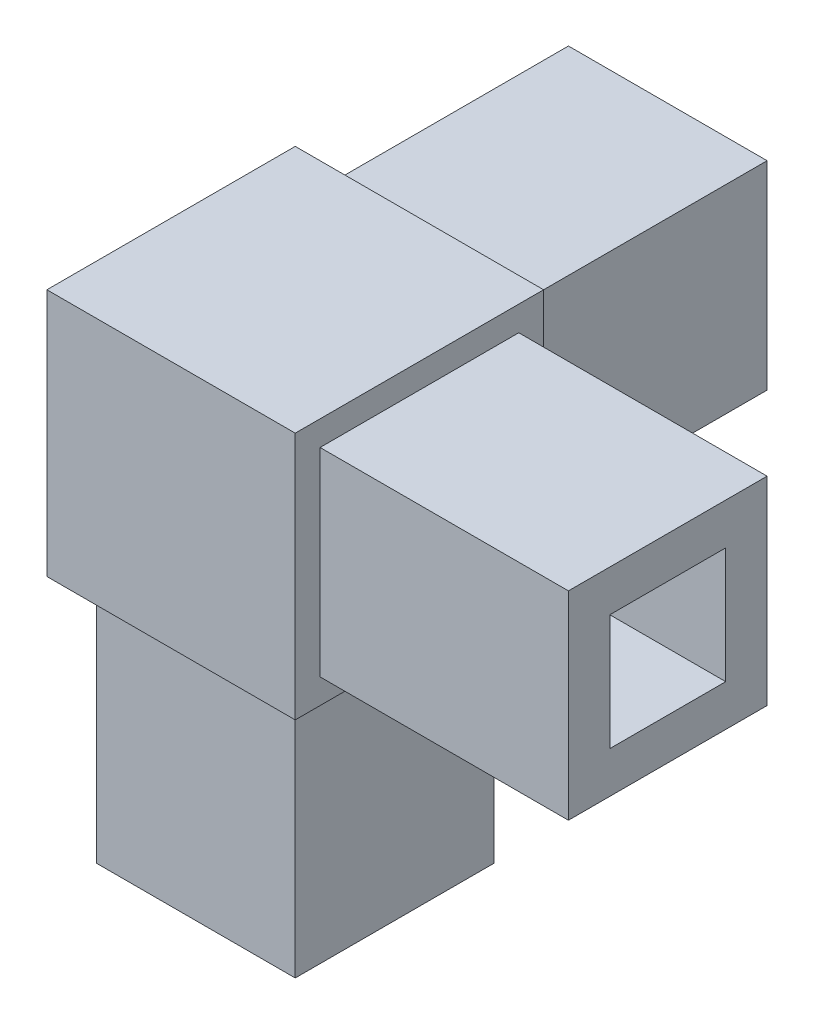
ISO-10303-21;
HEADER;
FILE_DESCRIPTION(('STEP AP214'),'2;1');
FILE_NAME('part.step','',(''),(''),'','','');
FILE_SCHEMA(('AUTOMOTIVE_DESIGN { 1 0 10303 214 1 1 1 1 }'));
ENDSEC;
DATA;
#1=APPLICATION_CONTEXT('core data for automotive mechanical design processes');
#2=APPLICATION_PROTOCOL_DEFINITION('international standard','automotive_design',2000,#1);
#3=PRODUCT_CONTEXT('',#1,'mechanical');
#4=PRODUCT('Part','Part','',(#3));
#5=PRODUCT_RELATED_PRODUCT_CATEGORY('part','',(#4));
#6=PRODUCT_DEFINITION_FORMATION('','',#4);
#7=PRODUCT_DEFINITION_CONTEXT('part definition',#1,'design');
#8=PRODUCT_DEFINITION('design','',#6,#7);
#9=PRODUCT_DEFINITION_SHAPE('','',#8);
#10=(LENGTH_UNIT() NAMED_UNIT(*) SI_UNIT(.MILLI.,.METRE.));
#11=(NAMED_UNIT(*) PLANE_ANGLE_UNIT() SI_UNIT($,.RADIAN.));
#12=(NAMED_UNIT(*) SI_UNIT($,.STERADIAN.) SOLID_ANGLE_UNIT());
#13=UNCERTAINTY_MEASURE_WITH_UNIT(LENGTH_MEASURE(1.E-05),#10,'distance_accuracy_value','');
#14=(GEOMETRIC_REPRESENTATION_CONTEXT(3) GLOBAL_UNCERTAINTY_ASSIGNED_CONTEXT((#13)) GLOBAL_UNIT_ASSIGNED_CONTEXT((#10,
#11,#12)) REPRESENTATION_CONTEXT('',''));
#15=CARTESIAN_POINT('',(0.,0.,0.));
#16=DIRECTION('',(0.,0.,1.));
#17=DIRECTION('',(1.,0.,0.));
#18=AXIS2_PLACEMENT_3D('',#15,#16,#17);
#19=CARTESIAN_POINT('',(45.,30.,-11.719834290647));
#20=DIRECTION('',(-1.,0.,0.));
#21=DIRECTION('',(0.,0.,1.));
#22=AXIS2_PLACEMENT_3D('',#19,#20,#21);
#23=PLANE('',#22);
#24=DIRECTION('',(0.,-1.,0.));
#25=VECTOR('',#24,1.);
#26=CARTESIAN_POINT('',(45.,27.,12.));
#27=LINE('',#26,#25);
#28=CARTESIAN_POINT('',(45.,27.,12.));
#29=VERTEX_POINT('',#28);
#30=CARTESIAN_POINT('',(45.,3.,12.));
#31=VERTEX_POINT('',#30);
#32=EDGE_CURVE('E460',#29,#31,#27,.T.);
#33=ORIENTED_EDGE('',*,*,#32,.T.);
#34=DIRECTION('',(0.,0.,-1.));
#35=VECTOR('',#34,1.);
#36=CARTESIAN_POINT('',(45.,3.,12.));
#37=LINE('',#36,#35);
#38=CARTESIAN_POINT('',(45.,3.,-12.));
#39=VERTEX_POINT('',#38);
#40=EDGE_CURVE('E477',#31,#39,#37,.T.);
#41=ORIENTED_EDGE('',*,*,#40,.T.);
#42=DIRECTION('',(0.,1.,0.));
#43=VECTOR('',#42,1.);
#44=CARTESIAN_POINT('',(45.,3.,-12.));
#45=LINE('',#44,#43);
#46=CARTESIAN_POINT('',(45.,27.,-12.));
#47=VERTEX_POINT('',#46);
#48=EDGE_CURVE('E480',#39,#47,#45,.T.);
#49=ORIENTED_EDGE('',*,*,#48,.T.);
#50=DIRECTION('',(0.,0.,1.));
#51=VECTOR('',#50,1.);
#52=CARTESIAN_POINT('',(45.,27.,-12.));
#53=LINE('',#52,#51);
#54=EDGE_CURVE('E465',#47,#29,#53,.T.);
#55=ORIENTED_EDGE('',*,*,#54,.T.);
#56=EDGE_LOOP('',(#33,#41,#49,#55));
#57=FACE_BOUND('',#56,.T.);
#58=DIRECTION('',(0.,-1.,0.));
#59=VECTOR('',#58,1.);
#60=CARTESIAN_POINT('',(45.,27.,7.));
#61=LINE('',#60,#59);
#62=CARTESIAN_POINT('',(45.,22.,7.));
#63=VERTEX_POINT('',#62);
#64=CARTESIAN_POINT('',(45.,8.,7.));
#65=VERTEX_POINT('',#64);
#66=EDGE_CURVE('E269',#63,#65,#61,.T.);
#67=ORIENTED_EDGE('',*,*,#66,.F.);
#68=DIRECTION('',(0.,0.,1.));
#69=VECTOR('',#68,1.);
#70=CARTESIAN_POINT('',(45.,22.,-12.));
#71=LINE('',#70,#69);
#72=CARTESIAN_POINT('',(45.,22.,-7.));
#73=VERTEX_POINT('',#72);
#74=EDGE_CURVE('E302',#73,#63,#71,.T.);
#75=ORIENTED_EDGE('',*,*,#74,.F.);
#76=DIRECTION('',(0.,1.,0.));
#77=VECTOR('',#76,1.);
#78=CARTESIAN_POINT('',(45.,3.,-7.));
#79=LINE('',#78,#77);
#80=CARTESIAN_POINT('',(45.,8.,-7.));
#81=VERTEX_POINT('',#80);
#82=EDGE_CURVE('E55',#81,#73,#79,.T.);
#83=ORIENTED_EDGE('',*,*,#82,.F.);
#84=DIRECTION('',(0.,0.,-1.));
#85=VECTOR('',#84,1.);
#86=CARTESIAN_POINT('',(45.,8.,12.));
#87=LINE('',#86,#85);
#88=EDGE_CURVE('E377',#65,#81,#87,.T.);
#89=ORIENTED_EDGE('',*,*,#88,.F.);
#90=EDGE_LOOP('',(#67,#75,#83,#89));
#91=FACE_BOUND('',#90,.T.);
#92=ADVANCED_FACE('F37',(#57,#91),#23,.F.);
#93=CARTESIAN_POINT('',(-15.,30.,-11.719834290647));
#94=DIRECTION('',(-1.,0.,0.));
#95=DIRECTION('',(0.,0.,1.));
#96=AXIS2_PLACEMENT_3D('',#93,#94,#95);
#97=PLANE('',#96);
#98=DIRECTION('',(0.,1.,0.));
#99=VECTOR('',#98,1.);
#100=CARTESIAN_POINT('',(-15.,-30.,-15.));
#101=LINE('',#100,#99);
#102=CARTESIAN_POINT('',(-15.,0.,-15.));
#103=VERTEX_POINT('',#102);
#104=CARTESIAN_POINT('',(-15.,30.,-15.));
#105=VERTEX_POINT('',#104);
#106=EDGE_CURVE('E495',#103,#105,#101,.T.);
#107=ORIENTED_EDGE('',*,*,#106,.F.);
#108=DIRECTION('',(0.,0.,-1.));
#109=VECTOR('',#108,1.);
#110=CARTESIAN_POINT('',(-15.,0.,15.));
#111=LINE('',#110,#109);
#112=CARTESIAN_POINT('',(-15.,0.,15.));
#113=VERTEX_POINT('',#112);
#114=EDGE_CURVE('E418',#113,#103,#111,.T.);
#115=ORIENTED_EDGE('',*,*,#114,.F.);
#116=DIRECTION('',(0.,-1.,0.));
#117=VECTOR('',#116,1.);
#118=CARTESIAN_POINT('',(-15.,30.,15.));
#119=LINE('',#118,#117);
#120=CARTESIAN_POINT('',(-15.,30.,15.));
#121=VERTEX_POINT('',#120);
#122=EDGE_CURVE('E11',#121,#113,#119,.T.);
#123=ORIENTED_EDGE('',*,*,#122,.F.);
#124=DIRECTION('',(0.,0.,-1.));
#125=VECTOR('',#124,1.);
#126=CARTESIAN_POINT('',(-15.,30.,-11.719834290647));
#127=LINE('',#126,#125);
#128=EDGE_CURVE('E496',#121,#105,#127,.T.);
#129=ORIENTED_EDGE('',*,*,#128,.T.);
#130=EDGE_LOOP('',(#107,#115,#123,#129));
#131=FACE_BOUND('',#130,.T.);
#132=ADVANCED_FACE('F39',(#131),#97,.T.);
#133=CARTESIAN_POINT('',(15.,30.,-11.719834290647));
#134=DIRECTION('',(-1.,0.,0.));
#135=DIRECTION('',(0.,0.,1.));
#136=AXIS2_PLACEMENT_3D('',#133,#134,#135);
#137=PLANE('',#136);
#138=DIRECTION('',(0.,0.,1.));
#139=VECTOR('',#138,1.);
#140=CARTESIAN_POINT('',(15.,27.,-12.));
#141=LINE('',#140,#139);
#142=CARTESIAN_POINT('',(15.,27.,-12.));
#143=VERTEX_POINT('',#142);
#144=CARTESIAN_POINT('',(15.,27.,12.));
#145=VERTEX_POINT('',#144);
#146=EDGE_CURVE('E471',#143,#145,#141,.T.);
#147=ORIENTED_EDGE('',*,*,#146,.F.);
#148=DIRECTION('',(0.,1.,0.));
#149=VECTOR('',#148,1.);
#150=CARTESIAN_POINT('',(15.,3.,-12.));
#151=LINE('',#150,#149);
#152=CARTESIAN_POINT('',(15.,3.,-12.));
#153=VERTEX_POINT('',#152);
#154=EDGE_CURVE('E468',#153,#143,#151,.T.);
#155=ORIENTED_EDGE('',*,*,#154,.F.);
#156=DIRECTION('',(0.,0.,-1.));
#157=VECTOR('',#156,1.);
#158=CARTESIAN_POINT('',(15.,3.,12.));
#159=LINE('',#158,#157);
#160=CARTESIAN_POINT('',(15.,3.,12.));
#161=VERTEX_POINT('',#160);
#162=EDGE_CURVE('E464',#161,#153,#159,.T.);
#163=ORIENTED_EDGE('',*,*,#162,.F.);
#164=DIRECTION('',(0.,-1.,0.));
#165=VECTOR('',#164,1.);
#166=CARTESIAN_POINT('',(15.,27.,12.));
#167=LINE('',#166,#165);
#168=EDGE_CURVE('E461',#145,#161,#167,.T.);
#169=ORIENTED_EDGE('',*,*,#168,.F.);
#170=EDGE_LOOP('',(#147,#155,#163,#169));
#171=FACE_BOUND('',#170,.T.);
#172=DIRECTION('',(0.,0.,1.));
#173=VECTOR('',#172,1.);
#174=CARTESIAN_POINT('',(15.,0.,-15.));
#175=LINE('',#174,#173);
#176=CARTESIAN_POINT('',(15.,0.,-15.));
#177=VERTEX_POINT('',#176);
#178=CARTESIAN_POINT('',(15.,0.,15.));
#179=VERTEX_POINT('',#178);
#180=EDGE_CURVE('E422',#177,#179,#175,.T.);
#181=ORIENTED_EDGE('',*,*,#180,.F.);
#182=DIRECTION('',(0.,1.,0.));
#183=VECTOR('',#182,1.);
#184=CARTESIAN_POINT('',(15.,-30.,-15.));
#185=LINE('',#184,#183);
#186=CARTESIAN_POINT('',(15.,30.,-15.));
#187=VERTEX_POINT('',#186);
#188=EDGE_CURVE('E493',#177,#187,#185,.T.);
#189=ORIENTED_EDGE('',*,*,#188,.T.);
#190=DIRECTION('',(0.,0.,-1.));
#191=VECTOR('',#190,1.);
#192=CARTESIAN_POINT('',(15.,30.,-11.719834290647));
#193=LINE('',#192,#191);
#194=CARTESIAN_POINT('',(15.,30.,15.));
#195=VERTEX_POINT('',#194);
#196=EDGE_CURVE('E47',#195,#187,#193,.T.);
#197=ORIENTED_EDGE('',*,*,#196,.F.);
#198=DIRECTION('',(0.,1.,0.));
#199=VECTOR('',#198,1.);
#200=CARTESIAN_POINT('',(15.,-30.,15.));
#201=LINE('',#200,#199);
#202=EDGE_CURVE('E41',#179,#195,#201,.T.);
#203=ORIENTED_EDGE('',*,*,#202,.F.);
#204=EDGE_LOOP('',(#181,#189,#197,#203));
#205=FACE_BOUND('',#204,.T.);
#206=ADVANCED_FACE('F525',(#171,#205),#137,.F.);
#207=CARTESIAN_POINT('',(-70.1056236686776,30.,15.));
#208=DIRECTION('',(0.,0.,1.));
#209=DIRECTION('',(1.,0.,0.));
#210=AXIS2_PLACEMENT_3D('',#207,#208,#209);
#211=PLANE('',#210);
#212=ORIENTED_EDGE('',*,*,#122,.T.);
#213=DIRECTION('',(-1.,0.,0.));
#214=VECTOR('',#213,1.);
#215=CARTESIAN_POINT('',(15.,0.,15.));
#216=LINE('',#215,#214);
#217=EDGE_CURVE('E410',#179,#113,#216,.T.);
#218=ORIENTED_EDGE('',*,*,#217,.F.);
#219=ORIENTED_EDGE('',*,*,#202,.T.);
#220=DIRECTION('',(-1.,0.,0.));
#221=VECTOR('',#220,1.);
#222=CARTESIAN_POINT('',(-70.1056236686776,30.,15.));
#223=LINE('',#222,#221);
#224=EDGE_CURVE('E499',#195,#121,#223,.T.);
#225=ORIENTED_EDGE('',*,*,#224,.T.);
#226=EDGE_LOOP('',(#212,#218,#219,#225));
#227=FACE_BOUND('',#226,.T.);
#228=ADVANCED_FACE('F521',(#227),#211,.T.);
#229=CARTESIAN_POINT('',(-15.,-30.,-15.));
#230=DIRECTION('',(0.,0.,1.));
#231=DIRECTION('',(1.,0.,0.));
#232=AXIS2_PLACEMENT_3D('',#229,#230,#231);
#233=PLANE('',#232);
#234=DIRECTION('',(1.,0.,0.));
#235=VECTOR('',#234,1.);
#236=CARTESIAN_POINT('',(-12.,27.,-15.));
#237=LINE('',#236,#235);
#238=CARTESIAN_POINT('',(-12.,27.,-15.));
#239=VERTEX_POINT('',#238);
#240=CARTESIAN_POINT('',(12.,27.,-15.));
#241=VERTEX_POINT('',#240);
#242=EDGE_CURVE('E435',#239,#241,#237,.T.);
#243=ORIENTED_EDGE('',*,*,#242,.F.);
#244=DIRECTION('',(0.,1.,0.));
#245=VECTOR('',#244,1.);
#246=CARTESIAN_POINT('',(-12.,3.,-15.));
#247=LINE('',#246,#245);
#248=CARTESIAN_POINT('',(-12.,3.,-15.));
#249=VERTEX_POINT('',#248);
#250=EDGE_CURVE('E432',#249,#239,#247,.T.);
#251=ORIENTED_EDGE('',*,*,#250,.F.);
#252=DIRECTION('',(-1.,0.,0.));
#253=VECTOR('',#252,1.);
#254=CARTESIAN_POINT('',(12.,3.,-15.));
#255=LINE('',#254,#253);
#256=CARTESIAN_POINT('',(12.,3.,-15.));
#257=VERTEX_POINT('',#256);
#258=EDGE_CURVE('E428',#257,#249,#255,.T.);
#259=ORIENTED_EDGE('',*,*,#258,.F.);
#260=DIRECTION('',(0.,-1.,0.));
#261=VECTOR('',#260,1.);
#262=CARTESIAN_POINT('',(12.,27.,-15.));
#263=LINE('',#262,#261);
#264=EDGE_CURVE('E425',#241,#257,#263,.T.);
#265=ORIENTED_EDGE('',*,*,#264,.F.);
#266=EDGE_LOOP('',(#243,#251,#259,#265));
#267=FACE_BOUND('',#266,.T.);
#268=DIRECTION('',(1.,0.,0.));
#269=VECTOR('',#268,1.);
#270=CARTESIAN_POINT('',(-15.,0.,-15.));
#271=LINE('',#270,#269);
#272=EDGE_CURVE('E420',#103,#177,#271,.T.);
#273=ORIENTED_EDGE('',*,*,#272,.F.);
#274=ORIENTED_EDGE('',*,*,#106,.T.);
#275=DIRECTION('',(1.,0.,0.));
#276=VECTOR('',#275,1.);
#277=CARTESIAN_POINT('',(-15.,30.,-15.));
#278=LINE('',#277,#276);
#279=EDGE_CURVE('E451',#105,#187,#278,.T.);
#280=ORIENTED_EDGE('',*,*,#279,.T.);
#281=ORIENTED_EDGE('',*,*,#188,.F.);
#282=EDGE_LOOP('',(#273,#274,#280,#281));
#283=FACE_BOUND('',#282,.T.);
#284=ADVANCED_FACE('F509',(#267,#283),#233,.F.);
#285=CARTESIAN_POINT('',(-70.1056236686776,30.,-11.719834290647));
#286=DIRECTION('',(0.,1.,0.));
#287=DIRECTION('',(0.,0.,1.));
#288=AXIS2_PLACEMENT_3D('',#285,#286,#287);
#289=PLANE('',#288);
#290=ORIENTED_EDGE('',*,*,#196,.T.);
#291=ORIENTED_EDGE('',*,*,#279,.F.);
#292=ORIENTED_EDGE('',*,*,#128,.F.);
#293=ORIENTED_EDGE('',*,*,#224,.F.);
#294=EDGE_LOOP('',(#290,#291,#292,#293));
#295=FACE_BOUND('',#294,.T.);
#296=ADVANCED_FACE('F515',(#295),#289,.T.);
#297=CARTESIAN_POINT('',(15.,27.,12.));
#298=DIRECTION('',(0.,0.,1.));
#299=DIRECTION('',(1.,0.,0.));
#300=AXIS2_PLACEMENT_3D('',#297,#298,#299);
#301=PLANE('',#300);
#302=ORIENTED_EDGE('',*,*,#32,.F.);
#303=DIRECTION('',(1.,0.,0.));
#304=VECTOR('',#303,1.);
#305=CARTESIAN_POINT('',(15.,27.,12.));
#306=LINE('',#305,#304);
#307=EDGE_CURVE('E485',#145,#29,#306,.T.);
#308=ORIENTED_EDGE('',*,*,#307,.F.);
#309=ORIENTED_EDGE('',*,*,#168,.T.);
#310=DIRECTION('',(1.,0.,0.));
#311=VECTOR('',#310,1.);
#312=CARTESIAN_POINT('',(15.,3.,12.));
#313=LINE('',#312,#311);
#314=EDGE_CURVE('E474',#161,#31,#313,.T.);
#315=ORIENTED_EDGE('',*,*,#314,.T.);
#316=EDGE_LOOP('',(#302,#308,#309,#315));
#317=FACE_BOUND('',#316,.T.);
#318=ADVANCED_FACE('F576',(#317),#301,.T.);
#319=CARTESIAN_POINT('',(15.,27.,-12.));
#320=DIRECTION('',(0.,1.,0.));
#321=DIRECTION('',(0.,0.,1.));
#322=AXIS2_PLACEMENT_3D('',#319,#320,#321);
#323=PLANE('',#322);
#324=ORIENTED_EDGE('',*,*,#54,.F.);
#325=DIRECTION('',(1.,0.,0.));
#326=VECTOR('',#325,1.);
#327=CARTESIAN_POINT('',(15.,27.,-12.));
#328=LINE('',#327,#326);
#329=EDGE_CURVE('E487',#143,#47,#328,.T.);
#330=ORIENTED_EDGE('',*,*,#329,.F.);
#331=ORIENTED_EDGE('',*,*,#146,.T.);
#332=ORIENTED_EDGE('',*,*,#307,.T.);
#333=EDGE_LOOP('',(#324,#330,#331,#332));
#334=FACE_BOUND('',#333,.T.);
#335=ADVANCED_FACE('F577',(#334),#323,.T.);
#336=CARTESIAN_POINT('',(15.,3.,-12.));
#337=DIRECTION('',(0.,0.,-1.));
#338=DIRECTION('',(-1.,0.,0.));
#339=AXIS2_PLACEMENT_3D('',#336,#337,#338);
#340=PLANE('',#339);
#341=ORIENTED_EDGE('',*,*,#48,.F.);
#342=DIRECTION('',(1.,0.,0.));
#343=VECTOR('',#342,1.);
#344=CARTESIAN_POINT('',(15.,3.,-12.));
#345=LINE('',#344,#343);
#346=EDGE_CURVE('E489',#153,#39,#345,.T.);
#347=ORIENTED_EDGE('',*,*,#346,.F.);
#348=ORIENTED_EDGE('',*,*,#154,.T.);
#349=ORIENTED_EDGE('',*,*,#329,.T.);
#350=EDGE_LOOP('',(#341,#347,#348,#349));
#351=FACE_BOUND('',#350,.T.);
#352=ADVANCED_FACE('F569',(#351),#340,.T.);
#353=CARTESIAN_POINT('',(15.,3.,12.));
#354=DIRECTION('',(0.,-1.,0.));
#355=DIRECTION('',(0.,0.,-1.));
#356=AXIS2_PLACEMENT_3D('',#353,#354,#355);
#357=PLANE('',#356);
#358=ORIENTED_EDGE('',*,*,#40,.F.);
#359=ORIENTED_EDGE('',*,*,#314,.F.);
#360=ORIENTED_EDGE('',*,*,#162,.T.);
#361=ORIENTED_EDGE('',*,*,#346,.T.);
#362=EDGE_LOOP('',(#358,#359,#360,#361));
#363=FACE_BOUND('',#362,.T.);
#364=ADVANCED_FACE('F573',(#363),#357,.T.);
#365=CARTESIAN_POINT('',(12.,27.,-15.));
#366=DIRECTION('',(1.,0.,0.));
#367=DIRECTION('',(0.,1.,0.));
#368=AXIS2_PLACEMENT_3D('',#365,#366,#367);
#369=PLANE('',#368);
#370=DIRECTION('',(0.,-1.,0.));
#371=VECTOR('',#370,1.);
#372=CARTESIAN_POINT('',(12.,27.,-45.));
#373=LINE('',#372,#371);
#374=CARTESIAN_POINT('',(12.,27.,-45.));
#375=VERTEX_POINT('',#374);
#376=CARTESIAN_POINT('',(12.,3.,-45.));
#377=VERTEX_POINT('',#376);
#378=EDGE_CURVE('E424',#375,#377,#373,.T.);
#379=ORIENTED_EDGE('',*,*,#378,.F.);
#380=DIRECTION('',(0.,0.,-1.));
#381=VECTOR('',#380,1.);
#382=CARTESIAN_POINT('',(12.,27.,-15.));
#383=LINE('',#382,#381);
#384=EDGE_CURVE('E449',#241,#375,#383,.T.);
#385=ORIENTED_EDGE('',*,*,#384,.F.);
#386=ORIENTED_EDGE('',*,*,#264,.T.);
#387=DIRECTION('',(0.,0.,-1.));
#388=VECTOR('',#387,1.);
#389=CARTESIAN_POINT('',(12.,3.,-15.));
#390=LINE('',#389,#388);
#391=EDGE_CURVE('E438',#257,#377,#390,.T.);
#392=ORIENTED_EDGE('',*,*,#391,.T.);
#393=EDGE_LOOP('',(#379,#385,#386,#392));
#394=FACE_BOUND('',#393,.T.);
#395=ADVANCED_FACE('F587',(#394),#369,.T.);
#396=CARTESIAN_POINT('',(-12.,27.,-15.));
#397=DIRECTION('',(0.,1.,0.));
#398=DIRECTION('',(-1.,0.,0.));
#399=AXIS2_PLACEMENT_3D('',#396,#397,#398);
#400=PLANE('',#399);
#401=DIRECTION('',(1.,0.,0.));
#402=VECTOR('',#401,1.);
#403=CARTESIAN_POINT('',(-12.,27.,-45.));
#404=LINE('',#403,#402);
#405=CARTESIAN_POINT('',(-12.,27.,-45.));
#406=VERTEX_POINT('',#405);
#407=EDGE_CURVE('E429',#406,#375,#404,.T.);
#408=ORIENTED_EDGE('',*,*,#407,.F.);
#409=DIRECTION('',(0.,0.,-1.));
#410=VECTOR('',#409,1.);
#411=CARTESIAN_POINT('',(-12.,27.,-15.));
#412=LINE('',#411,#410);
#413=EDGE_CURVE('E452',#239,#406,#412,.T.);
#414=ORIENTED_EDGE('',*,*,#413,.F.);
#415=ORIENTED_EDGE('',*,*,#242,.T.);
#416=ORIENTED_EDGE('',*,*,#384,.T.);
#417=EDGE_LOOP('',(#408,#414,#415,#416));
#418=FACE_BOUND('',#417,.T.);
#419=ADVANCED_FACE('F631',(#418),#400,.T.);
#420=CARTESIAN_POINT('',(-12.,3.,-15.));
#421=DIRECTION('',(-1.,0.,0.));
#422=DIRECTION('',(0.,0.,1.));
#423=AXIS2_PLACEMENT_3D('',#420,#421,#422);
#424=PLANE('',#423);
#425=DIRECTION('',(0.,1.,0.));
#426=VECTOR('',#425,1.);
#427=CARTESIAN_POINT('',(-12.,3.,-45.));
#428=LINE('',#427,#426);
#429=CARTESIAN_POINT('',(-12.,3.,-45.));
#430=VERTEX_POINT('',#429);
#431=EDGE_CURVE('E444',#430,#406,#428,.T.);
#432=ORIENTED_EDGE('',*,*,#431,.F.);
#433=DIRECTION('',(0.,0.,-1.));
#434=VECTOR('',#433,1.);
#435=CARTESIAN_POINT('',(-12.,3.,-15.));
#436=LINE('',#435,#434);
#437=EDGE_CURVE('E454',#249,#430,#436,.T.);
#438=ORIENTED_EDGE('',*,*,#437,.F.);
#439=ORIENTED_EDGE('',*,*,#250,.T.);
#440=ORIENTED_EDGE('',*,*,#413,.T.);
#441=EDGE_LOOP('',(#432,#438,#439,#440));
#442=FACE_BOUND('',#441,.T.);
#443=ADVANCED_FACE('F638',(#442),#424,.T.);
#444=CARTESIAN_POINT('',(12.,3.,-15.));
#445=DIRECTION('',(0.,-1.,0.));
#446=DIRECTION('',(1.,0.,0.));
#447=AXIS2_PLACEMENT_3D('',#444,#445,#446);
#448=PLANE('',#447);
#449=DIRECTION('',(-1.,0.,0.));
#450=VECTOR('',#449,1.);
#451=CARTESIAN_POINT('',(12.,3.,-45.));
#452=LINE('',#451,#450);
#453=EDGE_CURVE('E441',#377,#430,#452,.T.);
#454=ORIENTED_EDGE('',*,*,#453,.F.);
#455=ORIENTED_EDGE('',*,*,#391,.F.);
#456=ORIENTED_EDGE('',*,*,#258,.T.);
#457=ORIENTED_EDGE('',*,*,#437,.T.);
#458=EDGE_LOOP('',(#454,#455,#456,#457));
#459=FACE_BOUND('',#458,.T.);
#460=ADVANCED_FACE('F540',(#459),#448,.T.);
#461=CARTESIAN_POINT('',(-70.1056236686776,30.,-45.));
#462=DIRECTION('',(0.,0.,-1.));
#463=DIRECTION('',(-1.,0.,0.));
#464=AXIS2_PLACEMENT_3D('',#461,#462,#463);
#465=PLANE('',#464);
#466=DIRECTION('',(1.,0.,0.));
#467=VECTOR('',#466,1.);
#468=CARTESIAN_POINT('',(-70.1056236686776,22.,-45.));
#469=LINE('',#468,#467);
#470=CARTESIAN_POINT('',(-7.,22.,-45.));
#471=VERTEX_POINT('',#470);
#472=CARTESIAN_POINT('',(7.,22.,-45.));
#473=VERTEX_POINT('',#472);
#474=EDGE_CURVE('E322',#471,#473,#469,.T.);
#475=ORIENTED_EDGE('',*,*,#474,.F.);
#476=DIRECTION('',(0.,1.,0.));
#477=VECTOR('',#476,1.);
#478=CARTESIAN_POINT('',(-7.00000000000001,30.,-45.));
#479=LINE('',#478,#477);
#480=CARTESIAN_POINT('',(-7.,8.,-45.));
#481=VERTEX_POINT('',#480);
#482=EDGE_CURVE('E360',#481,#471,#479,.T.);
#483=ORIENTED_EDGE('',*,*,#482,.F.);
#484=DIRECTION('',(-1.,0.,0.));
#485=VECTOR('',#484,1.);
#486=CARTESIAN_POINT('',(-70.1056236686776,8.,-45.));
#487=LINE('',#486,#485);
#488=CARTESIAN_POINT('',(7.,8.,-45.));
#489=VERTEX_POINT('',#488);
#490=EDGE_CURVE('E63',#489,#481,#487,.T.);
#491=ORIENTED_EDGE('',*,*,#490,.F.);
#492=DIRECTION('',(0.,-1.,0.));
#493=VECTOR('',#492,1.);
#494=CARTESIAN_POINT('',(7.00000000000001,30.,-45.));
#495=LINE('',#494,#493);
#496=EDGE_CURVE('E305',#473,#489,#495,.T.);
#497=ORIENTED_EDGE('',*,*,#496,.F.);
#498=EDGE_LOOP('',(#475,#483,#491,#497));
#499=FACE_BOUND('',#498,.T.);
#500=ORIENTED_EDGE('',*,*,#407,.T.);
#501=ORIENTED_EDGE('',*,*,#378,.T.);
#502=ORIENTED_EDGE('',*,*,#453,.T.);
#503=ORIENTED_EDGE('',*,*,#431,.T.);
#504=EDGE_LOOP('',(#500,#501,#502,#503));
#505=FACE_BOUND('',#504,.T.);
#506=ADVANCED_FACE('F530',(#499,#505),#465,.T.);
#507=CARTESIAN_POINT('',(-15.,0.,15.));
#508=DIRECTION('',(0.,-1.,0.));
#509=DIRECTION('',(0.,0.,-1.));
#510=AXIS2_PLACEMENT_3D('',#507,#508,#509);
#511=PLANE('',#510);
#512=DIRECTION('',(0.,0.,1.));
#513=VECTOR('',#512,1.);
#514=CARTESIAN_POINT('',(12.,0.,-12.));
#515=LINE('',#514,#513);
#516=CARTESIAN_POINT('',(12.,0.,-12.));
#517=VERTEX_POINT('',#516);
#518=CARTESIAN_POINT('',(12.,0.,12.));
#519=VERTEX_POINT('',#518);
#520=EDGE_CURVE('E393',#517,#519,#515,.T.);
#521=ORIENTED_EDGE('',*,*,#520,.F.);
#522=DIRECTION('',(1.,0.,0.));
#523=VECTOR('',#522,1.);
#524=CARTESIAN_POINT('',(-12.,0.,-12.));
#525=LINE('',#524,#523);
#526=CARTESIAN_POINT('',(-12.,0.,-12.));
#527=VERTEX_POINT('',#526);
#528=EDGE_CURVE('E390',#527,#517,#525,.T.);
#529=ORIENTED_EDGE('',*,*,#528,.F.);
#530=DIRECTION('',(0.,0.,-1.));
#531=VECTOR('',#530,1.);
#532=CARTESIAN_POINT('',(-12.,0.,12.));
#533=LINE('',#532,#531);
#534=CARTESIAN_POINT('',(-12.,0.,12.));
#535=VERTEX_POINT('',#534);
#536=EDGE_CURVE('E386',#535,#527,#533,.T.);
#537=ORIENTED_EDGE('',*,*,#536,.F.);
#538=DIRECTION('',(-1.,0.,0.));
#539=VECTOR('',#538,1.);
#540=CARTESIAN_POINT('',(12.,0.,12.));
#541=LINE('',#540,#539);
#542=EDGE_CURVE('E383',#519,#535,#541,.T.);
#543=ORIENTED_EDGE('',*,*,#542,.F.);
#544=EDGE_LOOP('',(#521,#529,#537,#543));
#545=FACE_BOUND('',#544,.T.);
#546=ORIENTED_EDGE('',*,*,#217,.T.);
#547=ORIENTED_EDGE('',*,*,#114,.T.);
#548=ORIENTED_EDGE('',*,*,#272,.T.);
#549=ORIENTED_EDGE('',*,*,#180,.T.);
#550=EDGE_LOOP('',(#546,#547,#548,#549));
#551=FACE_BOUND('',#550,.T.);
#552=ADVANCED_FACE('F527',(#545,#551),#511,.T.);
#553=CARTESIAN_POINT('',(12.,0.,12.));
#554=DIRECTION('',(0.,0.,1.));
#555=DIRECTION('',(1.,0.,0.));
#556=AXIS2_PLACEMENT_3D('',#553,#554,#555);
#557=PLANE('',#556);
#558=DIRECTION('',(-1.,0.,0.));
#559=VECTOR('',#558,1.);
#560=CARTESIAN_POINT('',(12.,-30.,12.));
#561=LINE('',#560,#559);
#562=CARTESIAN_POINT('',(12.,-30.,12.));
#563=VERTEX_POINT('',#562);
#564=CARTESIAN_POINT('',(-12.,-30.,12.));
#565=VERTEX_POINT('',#564);
#566=EDGE_CURVE('E397',#563,#565,#561,.T.);
#567=ORIENTED_EDGE('',*,*,#566,.F.);
#568=DIRECTION('',(0.,-1.,0.));
#569=VECTOR('',#568,1.);
#570=CARTESIAN_POINT('',(12.,0.,12.));
#571=LINE('',#570,#569);
#572=EDGE_CURVE('E408',#519,#563,#571,.T.);
#573=ORIENTED_EDGE('',*,*,#572,.F.);
#574=ORIENTED_EDGE('',*,*,#542,.T.);
#575=DIRECTION('',(0.,-1.,0.));
#576=VECTOR('',#575,1.);
#577=CARTESIAN_POINT('',(-12.,0.,12.));
#578=LINE('',#577,#576);
#579=EDGE_CURVE('E396',#535,#565,#578,.T.);
#580=ORIENTED_EDGE('',*,*,#579,.T.);
#581=EDGE_LOOP('',(#567,#573,#574,#580));
#582=FACE_BOUND('',#581,.T.);
#583=ADVANCED_FACE('F529',(#582),#557,.T.);
#584=CARTESIAN_POINT('',(12.,0.,-12.));
#585=DIRECTION('',(1.,0.,0.));
#586=DIRECTION('',(0.,0.,-1.));
#587=AXIS2_PLACEMENT_3D('',#584,#585,#586);
#588=PLANE('',#587);
#589=DIRECTION('',(0.,0.,1.));
#590=VECTOR('',#589,1.);
#591=CARTESIAN_POINT('',(12.,-30.,-12.));
#592=LINE('',#591,#590);
#593=CARTESIAN_POINT('',(12.,-30.,-12.));
#594=VERTEX_POINT('',#593);
#595=EDGE_CURVE('E387',#594,#563,#592,.T.);
#596=ORIENTED_EDGE('',*,*,#595,.F.);
#597=DIRECTION('',(0.,-1.,0.));
#598=VECTOR('',#597,1.);
#599=CARTESIAN_POINT('',(12.,0.,-12.));
#600=LINE('',#599,#598);
#601=EDGE_CURVE('E411',#517,#594,#600,.T.);
#602=ORIENTED_EDGE('',*,*,#601,.F.);
#603=ORIENTED_EDGE('',*,*,#520,.T.);
#604=ORIENTED_EDGE('',*,*,#572,.T.);
#605=EDGE_LOOP('',(#596,#602,#603,#604));
#606=FACE_BOUND('',#605,.T.);
#607=ADVANCED_FACE('F537',(#606),#588,.T.);
#608=CARTESIAN_POINT('',(-12.,0.,-12.));
#609=DIRECTION('',(0.,0.,-1.));
#610=DIRECTION('',(-1.,0.,0.));
#611=AXIS2_PLACEMENT_3D('',#608,#609,#610);
#612=PLANE('',#611);
#613=DIRECTION('',(1.,0.,0.));
#614=VECTOR('',#613,1.);
#615=CARTESIAN_POINT('',(-12.,-30.,-12.));
#616=LINE('',#615,#614);
#617=CARTESIAN_POINT('',(-12.,-30.,-12.));
#618=VERTEX_POINT('',#617);
#619=EDGE_CURVE('E403',#618,#594,#616,.T.);
#620=ORIENTED_EDGE('',*,*,#619,.F.);
#621=DIRECTION('',(0.,-1.,0.));
#622=VECTOR('',#621,1.);
#623=CARTESIAN_POINT('',(-12.,0.,-12.));
#624=LINE('',#623,#622);
#625=EDGE_CURVE('E413',#527,#618,#624,.T.);
#626=ORIENTED_EDGE('',*,*,#625,.F.);
#627=ORIENTED_EDGE('',*,*,#528,.T.);
#628=ORIENTED_EDGE('',*,*,#601,.T.);
#629=EDGE_LOOP('',(#620,#626,#627,#628));
#630=FACE_BOUND('',#629,.T.);
#631=ADVANCED_FACE('F856',(#630),#612,.T.);
#632=CARTESIAN_POINT('',(-12.,0.,12.));
#633=DIRECTION('',(-1.,0.,0.));
#634=DIRECTION('',(0.,0.,1.));
#635=AXIS2_PLACEMENT_3D('',#632,#633,#634);
#636=PLANE('',#635);
#637=DIRECTION('',(0.,0.,-1.));
#638=VECTOR('',#637,1.);
#639=CARTESIAN_POINT('',(-12.,-30.,12.));
#640=LINE('',#639,#638);
#641=EDGE_CURVE('E400',#565,#618,#640,.T.);
#642=ORIENTED_EDGE('',*,*,#641,.F.);
#643=ORIENTED_EDGE('',*,*,#579,.F.);
#644=ORIENTED_EDGE('',*,*,#536,.T.);
#645=ORIENTED_EDGE('',*,*,#625,.T.);
#646=EDGE_LOOP('',(#642,#643,#644,#645));
#647=FACE_BOUND('',#646,.T.);
#648=ADVANCED_FACE('F594',(#647),#636,.T.);
#649=CARTESIAN_POINT('',(-15.,-30.,-15.));
#650=DIRECTION('',(0.,-1.,0.));
#651=DIRECTION('',(0.,0.,-1.));
#652=AXIS2_PLACEMENT_3D('',#649,#650,#651);
#653=PLANE('',#652);
#654=DIRECTION('',(0.,0.,1.));
#655=VECTOR('',#654,1.);
#656=CARTESIAN_POINT('',(7.,-30.,-15.));
#657=LINE('',#656,#655);
#658=CARTESIAN_POINT('',(7.,-30.,-6.99999999999999));
#659=VERTEX_POINT('',#658);
#660=CARTESIAN_POINT('',(7.,-30.,7.));
#661=VERTEX_POINT('',#660);
#662=EDGE_CURVE('E343',#659,#661,#657,.T.);
#663=ORIENTED_EDGE('',*,*,#662,.F.);
#664=DIRECTION('',(1.,0.,0.));
#665=VECTOR('',#664,1.);
#666=CARTESIAN_POINT('',(-15.,-30.,-6.99999999999999));
#667=LINE('',#666,#665);
#668=CARTESIAN_POINT('',(-7.,-30.,-6.99999999999999));
#669=VERTEX_POINT('',#668);
#670=EDGE_CURVE('E370',#669,#659,#667,.T.);
#671=ORIENTED_EDGE('',*,*,#670,.F.);
#672=DIRECTION('',(0.,0.,-1.));
#673=VECTOR('',#672,1.);
#674=CARTESIAN_POINT('',(-7.,-30.,-15.));
#675=LINE('',#674,#673);
#676=CARTESIAN_POINT('',(-7.,-30.,7.));
#677=VERTEX_POINT('',#676);
#678=EDGE_CURVE('E368',#677,#669,#675,.T.);
#679=ORIENTED_EDGE('',*,*,#678,.F.);
#680=DIRECTION('',(-1.,0.,0.));
#681=VECTOR('',#680,1.);
#682=CARTESIAN_POINT('',(-15.,-30.,7.));
#683=LINE('',#682,#681);
#684=EDGE_CURVE('E365',#661,#677,#683,.T.);
#685=ORIENTED_EDGE('',*,*,#684,.F.);
#686=EDGE_LOOP('',(#663,#671,#679,#685));
#687=FACE_BOUND('',#686,.T.);
#688=ORIENTED_EDGE('',*,*,#595,.T.);
#689=ORIENTED_EDGE('',*,*,#566,.T.);
#690=ORIENTED_EDGE('',*,*,#641,.T.);
#691=ORIENTED_EDGE('',*,*,#619,.T.);
#692=EDGE_LOOP('',(#688,#689,#690,#691));
#693=FACE_BOUND('',#692,.T.);
#694=ADVANCED_FACE('F592',(#687,#693),#653,.T.);
#695=CARTESIAN_POINT('',(-10.,30.,-11.719834290647));
#696=DIRECTION('',(-1.,0.,0.));
#697=DIRECTION('',(0.,0.,1.));
#698=AXIS2_PLACEMENT_3D('',#695,#696,#697);
#699=PLANE('',#698);
#700=DIRECTION('',(0.,1.,0.));
#701=VECTOR('',#700,1.);
#702=CARTESIAN_POINT('',(-10.,30.,-9.99999999999999));
#703=LINE('',#702,#701);
#704=CARTESIAN_POINT('',(-10.,5.,-9.99999999999999));
#705=VERTEX_POINT('',#704);
#706=CARTESIAN_POINT('',(-10.,25.,-9.99999999999999));
#707=VERTEX_POINT('',#706);
#708=EDGE_CURVE('E250',#705,#707,#703,.T.);
#709=ORIENTED_EDGE('',*,*,#708,.T.);
#710=DIRECTION('',(0.,0.,-1.));
#711=VECTOR('',#710,1.);
#712=CARTESIAN_POINT('',(-10.,25.,-11.719834290647));
#713=LINE('',#712,#711);
#714=CARTESIAN_POINT('',(-10.,25.,10.));
#715=VERTEX_POINT('',#714);
#716=EDGE_CURVE('E255',#715,#707,#713,.T.);
#717=ORIENTED_EDGE('',*,*,#716,.F.);
#718=DIRECTION('',(0.,-1.,0.));
#719=VECTOR('',#718,1.);
#720=CARTESIAN_POINT('',(-9.99999999999999,30.,10.));
#721=LINE('',#720,#719);
#722=CARTESIAN_POINT('',(-10.,5.,10.));
#723=VERTEX_POINT('',#722);
#724=EDGE_CURVE('E281',#715,#723,#721,.T.);
#725=ORIENTED_EDGE('',*,*,#724,.T.);
#726=DIRECTION('',(0.,0.,-1.));
#727=VECTOR('',#726,1.);
#728=CARTESIAN_POINT('',(-10.,5.,15.));
#729=LINE('',#728,#727);
#730=EDGE_CURVE('E257',#723,#705,#729,.T.);
#731=ORIENTED_EDGE('',*,*,#730,.T.);
#732=EDGE_LOOP('',(#709,#717,#725,#731));
#733=FACE_BOUND('',#732,.T.);
#734=ADVANCED_FACE('F252',(#733),#699,.F.);
#735=CARTESIAN_POINT('',(10.,30.,-11.719834290647));
#736=DIRECTION('',(-1.,0.,0.));
#737=DIRECTION('',(0.,0.,1.));
#738=AXIS2_PLACEMENT_3D('',#735,#736,#737);
#739=PLANE('',#738);
#740=DIRECTION('',(0.,0.,1.));
#741=VECTOR('',#740,1.);
#742=CARTESIAN_POINT('',(10.,22.,-12.));
#743=LINE('',#742,#741);
#744=CARTESIAN_POINT('',(10.,22.,-7.));
#745=VERTEX_POINT('',#744);
#746=CARTESIAN_POINT('',(10.,22.,7.));
#747=VERTEX_POINT('',#746);
#748=EDGE_CURVE('E289',#745,#747,#743,.T.);
#749=ORIENTED_EDGE('',*,*,#748,.T.);
#750=DIRECTION('',(0.,-1.,0.));
#751=VECTOR('',#750,1.);
#752=CARTESIAN_POINT('',(10.,27.,7.));
#753=LINE('',#752,#751);
#754=CARTESIAN_POINT('',(10.,8.,7.));
#755=VERTEX_POINT('',#754);
#756=EDGE_CURVE('E299',#747,#755,#753,.T.);
#757=ORIENTED_EDGE('',*,*,#756,.T.);
#758=DIRECTION('',(0.,0.,-1.));
#759=VECTOR('',#758,1.);
#760=CARTESIAN_POINT('',(10.,8.,12.));
#761=LINE('',#760,#759);
#762=CARTESIAN_POINT('',(10.,8.,-7.));
#763=VERTEX_POINT('',#762);
#764=EDGE_CURVE('E296',#755,#763,#761,.T.);
#765=ORIENTED_EDGE('',*,*,#764,.T.);
#766=DIRECTION('',(0.,1.,0.));
#767=VECTOR('',#766,1.);
#768=CARTESIAN_POINT('',(10.,3.,-7.));
#769=LINE('',#768,#767);
#770=EDGE_CURVE('E293',#763,#745,#769,.T.);
#771=ORIENTED_EDGE('',*,*,#770,.T.);
#772=EDGE_LOOP('',(#749,#757,#765,#771));
#773=FACE_BOUND('',#772,.T.);
#774=DIRECTION('',(0.,0.,1.));
#775=VECTOR('',#774,1.);
#776=CARTESIAN_POINT('',(10.,5.,-11.719834290647));
#777=LINE('',#776,#775);
#778=CARTESIAN_POINT('',(10.,5.,-9.99999999999999));
#779=VERTEX_POINT('',#778);
#780=CARTESIAN_POINT('',(10.,5.,10.));
#781=VERTEX_POINT('',#780);
#782=EDGE_CURVE('E303',#779,#781,#777,.T.);
#783=ORIENTED_EDGE('',*,*,#782,.T.);
#784=DIRECTION('',(0.,1.,0.));
#785=VECTOR('',#784,1.);
#786=CARTESIAN_POINT('',(10.,30.,10.));
#787=LINE('',#786,#785);
#788=CARTESIAN_POINT('',(10.,25.,10.));
#789=VERTEX_POINT('',#788);
#790=EDGE_CURVE('E286',#781,#789,#787,.T.);
#791=ORIENTED_EDGE('',*,*,#790,.T.);
#792=DIRECTION('',(0.,0.,-1.));
#793=VECTOR('',#792,1.);
#794=CARTESIAN_POINT('',(10.,25.,-11.719834290647));
#795=LINE('',#794,#793);
#796=CARTESIAN_POINT('',(10.,25.,-9.99999999999999));
#797=VERTEX_POINT('',#796);
#798=EDGE_CURVE('E277',#789,#797,#795,.T.);
#799=ORIENTED_EDGE('',*,*,#798,.T.);
#800=DIRECTION('',(0.,1.,0.));
#801=VECTOR('',#800,1.);
#802=CARTESIAN_POINT('',(10.,30.,-9.99999999999999));
#803=LINE('',#802,#801);
#804=EDGE_CURVE('E260',#779,#797,#803,.T.);
#805=ORIENTED_EDGE('',*,*,#804,.F.);
#806=EDGE_LOOP('',(#783,#791,#799,#805));
#807=FACE_BOUND('',#806,.T.);
#808=ADVANCED_FACE('F677',(#773,#807),#739,.T.);
#809=CARTESIAN_POINT('',(-70.1056236686776,30.,10.));
#810=DIRECTION('',(0.,0.,1.));
#811=DIRECTION('',(1.,0.,0.));
#812=AXIS2_PLACEMENT_3D('',#809,#810,#811);
#813=PLANE('',#812);
#814=ORIENTED_EDGE('',*,*,#724,.F.);
#815=DIRECTION('',(-1.,0.,0.));
#816=VECTOR('',#815,1.);
#817=CARTESIAN_POINT('',(-70.1056236686776,25.,10.));
#818=LINE('',#817,#816);
#819=EDGE_CURVE('E274',#789,#715,#818,.T.);
#820=ORIENTED_EDGE('',*,*,#819,.F.);
#821=ORIENTED_EDGE('',*,*,#790,.F.);
#822=DIRECTION('',(-1.,0.,0.));
#823=VECTOR('',#822,1.);
#824=CARTESIAN_POINT('',(-15.,5.,10.));
#825=LINE('',#824,#823);
#826=EDGE_CURVE('E283',#781,#723,#825,.T.);
#827=ORIENTED_EDGE('',*,*,#826,.T.);
#828=EDGE_LOOP('',(#814,#820,#821,#827));
#829=FACE_BOUND('',#828,.T.);
#830=ADVANCED_FACE('F688',(#829),#813,.F.);
#831=CARTESIAN_POINT('',(-15.,-30.,-9.99999999999999));
#832=DIRECTION('',(0.,0.,1.));
#833=DIRECTION('',(1.,0.,0.));
#834=AXIS2_PLACEMENT_3D('',#831,#832,#833);
#835=PLANE('',#834);
#836=DIRECTION('',(1.,0.,0.));
#837=VECTOR('',#836,1.);
#838=CARTESIAN_POINT('',(-12.,22.,-9.99999999999999));
#839=LINE('',#838,#837);
#840=CARTESIAN_POINT('',(-7.,22.,-9.99999999999999));
#841=VERTEX_POINT('',#840);
#842=CARTESIAN_POINT('',(7.,22.,-9.99999999999999));
#843=VERTEX_POINT('',#842);
#844=EDGE_CURVE('E309',#841,#843,#839,.T.);
#845=ORIENTED_EDGE('',*,*,#844,.T.);
#846=DIRECTION('',(0.,-1.,0.));
#847=VECTOR('',#846,1.);
#848=CARTESIAN_POINT('',(7.,27.,-9.99999999999999));
#849=LINE('',#848,#847);
#850=CARTESIAN_POINT('',(7.,8.,-9.99999999999999));
#851=VERTEX_POINT('',#850);
#852=EDGE_CURVE('E319',#843,#851,#849,.T.);
#853=ORIENTED_EDGE('',*,*,#852,.T.);
#854=DIRECTION('',(-1.,0.,0.));
#855=VECTOR('',#854,1.);
#856=CARTESIAN_POINT('',(12.,8.,-9.99999999999999));
#857=LINE('',#856,#855);
#858=CARTESIAN_POINT('',(-7.,8.,-9.99999999999999));
#859=VERTEX_POINT('',#858);
#860=EDGE_CURVE('E316',#851,#859,#857,.T.);
#861=ORIENTED_EDGE('',*,*,#860,.T.);
#862=DIRECTION('',(0.,1.,0.));
#863=VECTOR('',#862,1.);
#864=CARTESIAN_POINT('',(-7.,3.,-9.99999999999999));
#865=LINE('',#864,#863);
#866=EDGE_CURVE('E313',#859,#841,#865,.T.);
#867=ORIENTED_EDGE('',*,*,#866,.T.);
#868=EDGE_LOOP('',(#845,#853,#861,#867));
#869=FACE_BOUND('',#868,.T.);
#870=DIRECTION('',(1.,0.,0.));
#871=VECTOR('',#870,1.);
#872=CARTESIAN_POINT('',(-15.,5.,-9.99999999999999));
#873=LINE('',#872,#871);
#874=EDGE_CURVE('E306',#705,#779,#873,.T.);
#875=ORIENTED_EDGE('',*,*,#874,.T.);
#876=ORIENTED_EDGE('',*,*,#804,.T.);
#877=DIRECTION('',(1.,0.,0.));
#878=VECTOR('',#877,1.);
#879=CARTESIAN_POINT('',(-70.1056236686776,25.,-9.99999999999998));
#880=LINE('',#879,#878);
#881=EDGE_CURVE('E263',#707,#797,#880,.T.);
#882=ORIENTED_EDGE('',*,*,#881,.F.);
#883=ORIENTED_EDGE('',*,*,#708,.F.);
#884=EDGE_LOOP('',(#875,#876,#882,#883));
#885=FACE_BOUND('',#884,.T.);
#886=ADVANCED_FACE('F264',(#869,#885),#835,.T.);
#887=CARTESIAN_POINT('',(-70.1056236686776,25.,-11.719834290647));
#888=DIRECTION('',(0.,1.,0.));
#889=DIRECTION('',(0.,0.,1.));
#890=AXIS2_PLACEMENT_3D('',#887,#888,#889);
#891=PLANE('',#890);
#892=ORIENTED_EDGE('',*,*,#798,.F.);
#893=ORIENTED_EDGE('',*,*,#819,.T.);
#894=ORIENTED_EDGE('',*,*,#716,.T.);
#895=ORIENTED_EDGE('',*,*,#881,.T.);
#896=EDGE_LOOP('',(#892,#893,#894,#895));
#897=FACE_BOUND('',#896,.T.);
#898=ADVANCED_FACE('F272',(#897),#891,.F.);
#899=CARTESIAN_POINT('',(15.,27.,7.));
#900=DIRECTION('',(0.,0.,1.));
#901=DIRECTION('',(1.,0.,0.));
#902=AXIS2_PLACEMENT_3D('',#899,#900,#901);
#903=PLANE('',#902);
#904=ORIENTED_EDGE('',*,*,#66,.T.);
#905=DIRECTION('',(1.,0.,0.));
#906=VECTOR('',#905,1.);
#907=CARTESIAN_POINT('',(15.,8.,7.));
#908=LINE('',#907,#906);
#909=EDGE_CURVE('E292',#755,#65,#908,.T.);
#910=ORIENTED_EDGE('',*,*,#909,.F.);
#911=ORIENTED_EDGE('',*,*,#756,.F.);
#912=DIRECTION('',(1.,0.,0.));
#913=VECTOR('',#912,1.);
#914=CARTESIAN_POINT('',(15.,22.,7.));
#915=LINE('',#914,#913);
#916=EDGE_CURVE('E287',#747,#63,#915,.T.);
#917=ORIENTED_EDGE('',*,*,#916,.T.);
#918=EDGE_LOOP('',(#904,#910,#911,#917));
#919=FACE_BOUND('',#918,.T.);
#920=ADVANCED_FACE('F721',(#919),#903,.F.);
#921=CARTESIAN_POINT('',(15.,22.,-12.));
#922=DIRECTION('',(0.,1.,0.));
#923=DIRECTION('',(0.,0.,1.));
#924=AXIS2_PLACEMENT_3D('',#921,#922,#923);
#925=PLANE('',#924);
#926=ORIENTED_EDGE('',*,*,#74,.T.);
#927=ORIENTED_EDGE('',*,*,#916,.F.);
#928=ORIENTED_EDGE('',*,*,#748,.F.);
#929=DIRECTION('',(1.,0.,0.));
#930=VECTOR('',#929,1.);
#931=CARTESIAN_POINT('',(15.,22.,-7.));
#932=LINE('',#931,#930);
#933=EDGE_CURVE('E352',#745,#73,#932,.T.);
#934=ORIENTED_EDGE('',*,*,#933,.T.);
#935=EDGE_LOOP('',(#926,#927,#928,#934));
#936=FACE_BOUND('',#935,.T.);
#937=ADVANCED_FACE('F731',(#936),#925,.F.);
#938=CARTESIAN_POINT('',(15.,3.,-7.));
#939=DIRECTION('',(0.,0.,-1.));
#940=DIRECTION('',(-1.,0.,0.));
#941=AXIS2_PLACEMENT_3D('',#938,#939,#940);
#942=PLANE('',#941);
#943=ORIENTED_EDGE('',*,*,#82,.T.);
#944=ORIENTED_EDGE('',*,*,#933,.F.);
#945=ORIENTED_EDGE('',*,*,#770,.F.);
#946=DIRECTION('',(1.,0.,0.));
#947=VECTOR('',#946,1.);
#948=CARTESIAN_POINT('',(15.,8.,-7.));
#949=LINE('',#948,#947);
#950=EDGE_CURVE('E354',#763,#81,#949,.T.);
#951=ORIENTED_EDGE('',*,*,#950,.T.);
#952=EDGE_LOOP('',(#943,#944,#945,#951));
#953=FACE_BOUND('',#952,.T.);
#954=ADVANCED_FACE('F741',(#953),#942,.F.);
#955=CARTESIAN_POINT('',(15.,8.,12.));
#956=DIRECTION('',(0.,-1.,0.));
#957=DIRECTION('',(0.,0.,-1.));
#958=AXIS2_PLACEMENT_3D('',#955,#956,#957);
#959=PLANE('',#958);
#960=ORIENTED_EDGE('',*,*,#88,.T.);
#961=ORIENTED_EDGE('',*,*,#950,.F.);
#962=ORIENTED_EDGE('',*,*,#764,.F.);
#963=ORIENTED_EDGE('',*,*,#909,.T.);
#964=EDGE_LOOP('',(#960,#961,#962,#963));
#965=FACE_BOUND('',#964,.T.);
#966=ADVANCED_FACE('F751',(#965),#959,.F.);
#967=CARTESIAN_POINT('',(7.,27.,-15.));
#968=DIRECTION('',(1.,0.,0.));
#969=DIRECTION('',(0.,1.,0.));
#970=AXIS2_PLACEMENT_3D('',#967,#968,#969);
#971=PLANE('',#970);
#972=ORIENTED_EDGE('',*,*,#496,.T.);
#973=DIRECTION('',(0.,0.,-1.));
#974=VECTOR('',#973,1.);
#975=CARTESIAN_POINT('',(7.,8.,-15.));
#976=LINE('',#975,#974);
#977=EDGE_CURVE('E312',#851,#489,#976,.T.);
#978=ORIENTED_EDGE('',*,*,#977,.F.);
#979=ORIENTED_EDGE('',*,*,#852,.F.);
#980=DIRECTION('',(0.,0.,-1.));
#981=VECTOR('',#980,1.);
#982=CARTESIAN_POINT('',(7.,22.,-15.));
#983=LINE('',#982,#981);
#984=EDGE_CURVE('E270',#843,#473,#983,.T.);
#985=ORIENTED_EDGE('',*,*,#984,.T.);
#986=EDGE_LOOP('',(#972,#978,#979,#985));
#987=FACE_BOUND('',#986,.T.);
#988=ADVANCED_FACE('F760',(#987),#971,.F.);
#989=CARTESIAN_POINT('',(-12.,22.,-15.));
#990=DIRECTION('',(0.,1.,0.));
#991=DIRECTION('',(-1.,0.,0.));
#992=AXIS2_PLACEMENT_3D('',#989,#990,#991);
#993=PLANE('',#992);
#994=ORIENTED_EDGE('',*,*,#474,.T.);
#995=ORIENTED_EDGE('',*,*,#984,.F.);
#996=ORIENTED_EDGE('',*,*,#844,.F.);
#997=DIRECTION('',(0.,0.,-1.));
#998=VECTOR('',#997,1.);
#999=CARTESIAN_POINT('',(-7.,22.,-15.));
#1000=LINE('',#999,#998);
#1001=EDGE_CURVE('E325',#841,#471,#1000,.T.);
#1002=ORIENTED_EDGE('',*,*,#1001,.T.);
#1003=EDGE_LOOP('',(#994,#995,#996,#1002));
#1004=FACE_BOUND('',#1003,.T.);
#1005=ADVANCED_FACE('F770',(#1004),#993,.F.);
#1006=CARTESIAN_POINT('',(-7.,3.,-15.));
#1007=DIRECTION('',(-1.,0.,0.));
#1008=DIRECTION('',(0.,0.,1.));
#1009=AXIS2_PLACEMENT_3D('',#1006,#1007,#1008);
#1010=PLANE('',#1009);
#1011=ORIENTED_EDGE('',*,*,#482,.T.);
#1012=ORIENTED_EDGE('',*,*,#1001,.F.);
#1013=ORIENTED_EDGE('',*,*,#866,.F.);
#1014=DIRECTION('',(0.,0.,-1.));
#1015=VECTOR('',#1014,1.);
#1016=CARTESIAN_POINT('',(-7.,8.,-15.));
#1017=LINE('',#1016,#1015);
#1018=EDGE_CURVE('E327',#859,#481,#1017,.T.);
#1019=ORIENTED_EDGE('',*,*,#1018,.T.);
#1020=EDGE_LOOP('',(#1011,#1012,#1013,#1019));
#1021=FACE_BOUND('',#1020,.T.);
#1022=ADVANCED_FACE('F780',(#1021),#1010,.F.);
#1023=CARTESIAN_POINT('',(12.,8.,-15.));
#1024=DIRECTION('',(0.,-1.,0.));
#1025=DIRECTION('',(1.,0.,0.));
#1026=AXIS2_PLACEMENT_3D('',#1023,#1024,#1025);
#1027=PLANE('',#1026);
#1028=ORIENTED_EDGE('',*,*,#490,.T.);
#1029=ORIENTED_EDGE('',*,*,#1018,.F.);
#1030=ORIENTED_EDGE('',*,*,#860,.F.);
#1031=ORIENTED_EDGE('',*,*,#977,.T.);
#1032=EDGE_LOOP('',(#1028,#1029,#1030,#1031));
#1033=FACE_BOUND('',#1032,.T.);
#1034=ADVANCED_FACE('F790',(#1033),#1027,.F.);
#1035=CARTESIAN_POINT('',(-15.,5.,15.));
#1036=DIRECTION('',(0.,-1.,0.));
#1037=DIRECTION('',(0.,0.,-1.));
#1038=AXIS2_PLACEMENT_3D('',#1035,#1036,#1037);
#1039=PLANE('',#1038);
#1040=DIRECTION('',(0.,0.,1.));
#1041=VECTOR('',#1040,1.);
#1042=CARTESIAN_POINT('',(7.,5.,15.));
#1043=LINE('',#1042,#1041);
#1044=CARTESIAN_POINT('',(7.,5.,-6.99999999999999));
#1045=VERTEX_POINT('',#1044);
#1046=CARTESIAN_POINT('',(7.,5.,7.));
#1047=VERTEX_POINT('',#1046);
#1048=EDGE_CURVE('E330',#1045,#1047,#1043,.T.);
#1049=ORIENTED_EDGE('',*,*,#1048,.T.);
#1050=DIRECTION('',(-1.,0.,0.));
#1051=VECTOR('',#1050,1.);
#1052=CARTESIAN_POINT('',(-15.,5.,7.));
#1053=LINE('',#1052,#1051);
#1054=CARTESIAN_POINT('',(-7.,5.,7.));
#1055=VERTEX_POINT('',#1054);
#1056=EDGE_CURVE('E340',#1047,#1055,#1053,.T.);
#1057=ORIENTED_EDGE('',*,*,#1056,.T.);
#1058=DIRECTION('',(0.,0.,-1.));
#1059=VECTOR('',#1058,1.);
#1060=CARTESIAN_POINT('',(-7.,5.,15.));
#1061=LINE('',#1060,#1059);
#1062=CARTESIAN_POINT('',(-7.,5.,-6.99999999999999));
#1063=VERTEX_POINT('',#1062);
#1064=EDGE_CURVE('E337',#1055,#1063,#1061,.T.);
#1065=ORIENTED_EDGE('',*,*,#1064,.T.);
#1066=DIRECTION('',(1.,0.,0.));
#1067=VECTOR('',#1066,1.);
#1068=CARTESIAN_POINT('',(-15.,5.,-6.99999999999999));
#1069=LINE('',#1068,#1067);
#1070=EDGE_CURVE('E334',#1063,#1045,#1069,.T.);
#1071=ORIENTED_EDGE('',*,*,#1070,.T.);
#1072=EDGE_LOOP('',(#1049,#1057,#1065,#1071));
#1073=FACE_BOUND('',#1072,.T.);
#1074=ORIENTED_EDGE('',*,*,#826,.F.);
#1075=ORIENTED_EDGE('',*,*,#782,.F.);
#1076=ORIENTED_EDGE('',*,*,#874,.F.);
#1077=ORIENTED_EDGE('',*,*,#730,.F.);
#1078=EDGE_LOOP('',(#1074,#1075,#1076,#1077));
#1079=FACE_BOUND('',#1078,.T.);
#1080=ADVANCED_FACE('F800',(#1073,#1079),#1039,.F.);
#1081=CARTESIAN_POINT('',(12.,0.,7.00000000000001));
#1082=DIRECTION('',(0.,0.,1.));
#1083=DIRECTION('',(1.,0.,0.));
#1084=AXIS2_PLACEMENT_3D('',#1081,#1082,#1083);
#1085=PLANE('',#1084);
#1086=ORIENTED_EDGE('',*,*,#684,.T.);
#1087=DIRECTION('',(0.,-1.,0.));
#1088=VECTOR('',#1087,1.);
#1089=CARTESIAN_POINT('',(-7.,0.,7.));
#1090=LINE('',#1089,#1088);
#1091=EDGE_CURVE('E333',#1055,#677,#1090,.T.);
#1092=ORIENTED_EDGE('',*,*,#1091,.F.);
#1093=ORIENTED_EDGE('',*,*,#1056,.F.);
#1094=DIRECTION('',(0.,-1.,0.));
#1095=VECTOR('',#1094,1.);
#1096=CARTESIAN_POINT('',(7.,0.,7.));
#1097=LINE('',#1096,#1095);
#1098=EDGE_CURVE('E285',#1047,#661,#1097,.T.);
#1099=ORIENTED_EDGE('',*,*,#1098,.T.);
#1100=EDGE_LOOP('',(#1086,#1092,#1093,#1099));
#1101=FACE_BOUND('',#1100,.T.);
#1102=ADVANCED_FACE('F809',(#1101),#1085,.F.);
#1103=CARTESIAN_POINT('',(7.,0.,-12.));
#1104=DIRECTION('',(1.,0.,0.));
#1105=DIRECTION('',(0.,0.,-1.));
#1106=AXIS2_PLACEMENT_3D('',#1103,#1104,#1105);
#1107=PLANE('',#1106);
#1108=ORIENTED_EDGE('',*,*,#662,.T.);
#1109=ORIENTED_EDGE('',*,*,#1098,.F.);
#1110=ORIENTED_EDGE('',*,*,#1048,.F.);
#1111=DIRECTION('',(0.,-1.,0.));
#1112=VECTOR('',#1111,1.);
#1113=CARTESIAN_POINT('',(7.,0.,-6.99999999999999));
#1114=LINE('',#1113,#1112);
#1115=EDGE_CURVE('E345',#1045,#659,#1114,.T.);
#1116=ORIENTED_EDGE('',*,*,#1115,.T.);
#1117=EDGE_LOOP('',(#1108,#1109,#1110,#1116));
#1118=FACE_BOUND('',#1117,.T.);
#1119=ADVANCED_FACE('F819',(#1118),#1107,.F.);
#1120=CARTESIAN_POINT('',(-12.,0.,-6.99999999999999));
#1121=DIRECTION('',(0.,0.,-1.));
#1122=DIRECTION('',(-1.,0.,0.));
#1123=AXIS2_PLACEMENT_3D('',#1120,#1121,#1122);
#1124=PLANE('',#1123);
#1125=ORIENTED_EDGE('',*,*,#670,.T.);
#1126=ORIENTED_EDGE('',*,*,#1115,.F.);
#1127=ORIENTED_EDGE('',*,*,#1070,.F.);
#1128=DIRECTION('',(0.,-1.,0.));
#1129=VECTOR('',#1128,1.);
#1130=CARTESIAN_POINT('',(-7.,0.,-6.99999999999999));
#1131=LINE('',#1130,#1129);
#1132=EDGE_CURVE('E347',#1063,#669,#1131,.T.);
#1133=ORIENTED_EDGE('',*,*,#1132,.T.);
#1134=EDGE_LOOP('',(#1125,#1126,#1127,#1133));
#1135=FACE_BOUND('',#1134,.T.);
#1136=ADVANCED_FACE('F829',(#1135),#1124,.F.);
#1137=CARTESIAN_POINT('',(-7.,0.,12.));
#1138=DIRECTION('',(-1.,0.,0.));
#1139=DIRECTION('',(0.,0.,1.));
#1140=AXIS2_PLACEMENT_3D('',#1137,#1138,#1139);
#1141=PLANE('',#1140);
#1142=ORIENTED_EDGE('',*,*,#678,.T.);
#1143=ORIENTED_EDGE('',*,*,#1132,.F.);
#1144=ORIENTED_EDGE('',*,*,#1064,.F.);
#1145=ORIENTED_EDGE('',*,*,#1091,.T.);
#1146=EDGE_LOOP('',(#1142,#1143,#1144,#1145));
#1147=FACE_BOUND('',#1146,.T.);
#1148=ADVANCED_FACE('F839',(#1147),#1141,.F.);
#1149=CLOSED_SHELL('',(#92,#132,#206,#228,#284,#296,#318,#335,#352,#364,#395,#419,#443,#460,
#506,#552,#583,#607,#631,#648,#694,#734,#808,#830,#886,#898,#920,#937,#954,#966,#988,#1005,
#1022,#1034,#1080,#1102,#1119,#1136,#1148));
#1150=MANIFOLD_SOLID_BREP('B2',#1149);
#1151=ADVANCED_BREP_SHAPE_REPRESENTATION('',(#18,#1150),#14);
#1152=SHAPE_DEFINITION_REPRESENTATION(#9,#1151);
ENDSEC;
END-ISO-10303-21;
